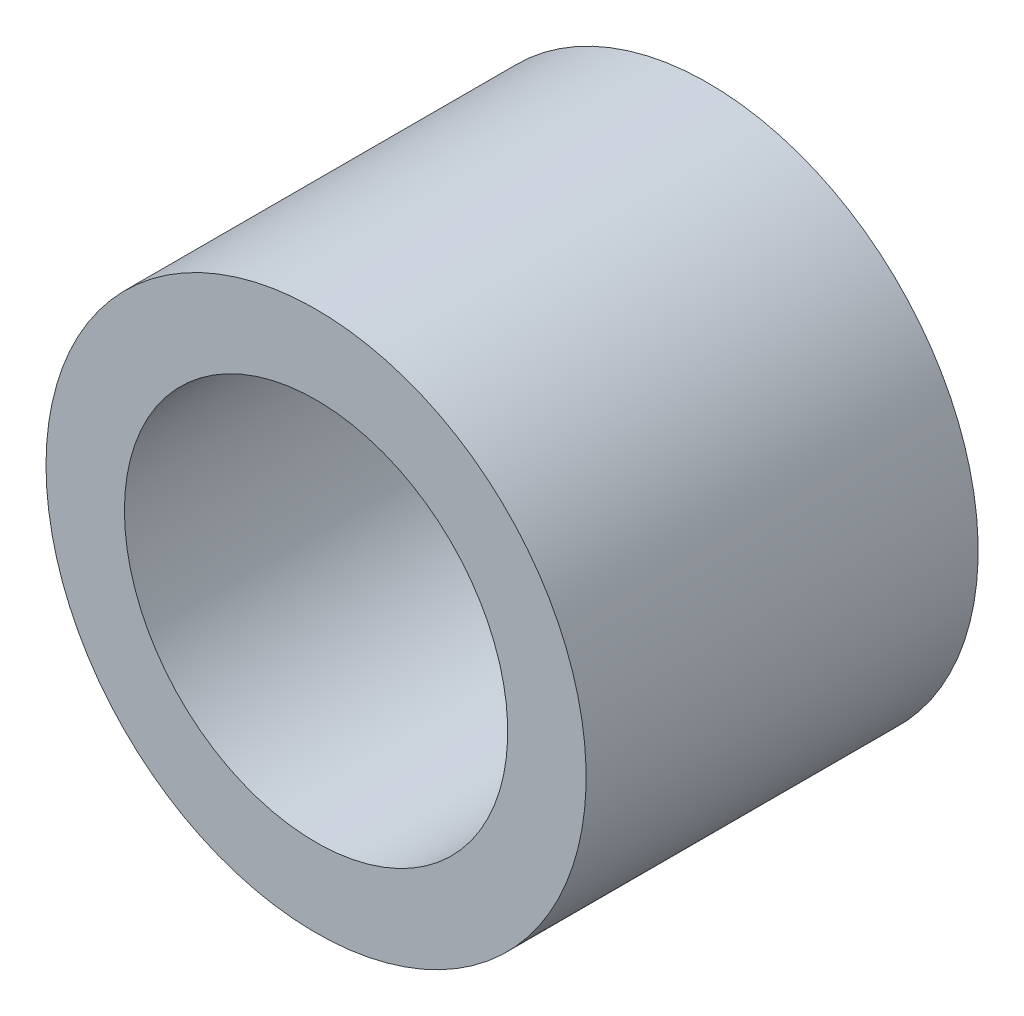
ISO-10303-21;
HEADER;
FILE_DESCRIPTION(('STEP AP214'),'2;1');
FILE_NAME('part.step','',(''),(''),'','','');
FILE_SCHEMA(('AUTOMOTIVE_DESIGN { 1 0 10303 214 1 1 1 1 }'));
ENDSEC;
DATA;
#1=APPLICATION_CONTEXT('core data for automotive mechanical design processes');
#2=APPLICATION_PROTOCOL_DEFINITION('international standard','automotive_design',2000,#1);
#3=PRODUCT_CONTEXT('',#1,'mechanical');
#4=PRODUCT('Part','Part','',(#3));
#5=PRODUCT_RELATED_PRODUCT_CATEGORY('part','',(#4));
#6=PRODUCT_DEFINITION_FORMATION('','',#4);
#7=PRODUCT_DEFINITION_CONTEXT('part definition',#1,'design');
#8=PRODUCT_DEFINITION('design','',#6,#7);
#9=PRODUCT_DEFINITION_SHAPE('','',#8);
#10=(LENGTH_UNIT() NAMED_UNIT(*) SI_UNIT(.MILLI.,.METRE.));
#11=(NAMED_UNIT(*) PLANE_ANGLE_UNIT() SI_UNIT($,.RADIAN.));
#12=(NAMED_UNIT(*) SI_UNIT($,.STERADIAN.) SOLID_ANGLE_UNIT());
#13=UNCERTAINTY_MEASURE_WITH_UNIT(LENGTH_MEASURE(1.E-05),#10,'distance_accuracy_value','');
#14=(GEOMETRIC_REPRESENTATION_CONTEXT(3) GLOBAL_UNCERTAINTY_ASSIGNED_CONTEXT((#13)) GLOBAL_UNIT_ASSIGNED_CONTEXT((#10,
#11,#12)) REPRESENTATION_CONTEXT('',''));
#15=CARTESIAN_POINT('',(0.,0.,0.));
#16=DIRECTION('',(0.,0.,1.));
#17=DIRECTION('',(1.,0.,0.));
#18=AXIS2_PLACEMENT_3D('',#15,#16,#17);
#19=CARTESIAN_POINT('',(0.,0.,22.5));
#20=DIRECTION('',(0.,0.,1.));
#21=DIRECTION('',(1.,0.,0.));
#22=AXIS2_PLACEMENT_3D('',#19,#20,#21);
#23=PLANE('',#22);
#24=CARTESIAN_POINT('',(0.,0.,22.5));
#25=DIRECTION('',(0.,0.,1.));
#26=DIRECTION('',(1.,0.,0.));
#27=AXIS2_PLACEMENT_3D('',#24,#25,#26);
#28=CIRCLE('',#27,15.5);
#29=CARTESIAN_POINT('',(-15.5,0.,22.5));
#30=VERTEX_POINT('',#29);
#31=EDGE_CURVE('E12',#30,#30,#28,.T.);
#32=ORIENTED_EDGE('',*,*,#31,.T.);
#33=EDGE_LOOP('',(#32));
#34=FACE_BOUND('',#33,.T.);
#35=CARTESIAN_POINT('',(0.,0.,22.5));
#36=DIRECTION('',(0.,0.,1.));
#37=DIRECTION('',(1.,0.,0.));
#38=AXIS2_PLACEMENT_3D('',#35,#36,#37);
#39=CIRCLE('',#38,11.);
#40=CARTESIAN_POINT('',(-11.,0.,22.5));
#41=VERTEX_POINT('',#40);
#42=EDGE_CURVE('E60',#41,#41,#39,.T.);
#43=ORIENTED_EDGE('',*,*,#42,.F.);
#44=EDGE_LOOP('',(#43));
#45=FACE_BOUND('',#44,.T.);
#46=ADVANCED_FACE('F47',(#34,#45),#23,.T.);
#47=CARTESIAN_POINT('',(0.,0.,0.));
#48=DIRECTION('',(0.,0.,1.));
#49=DIRECTION('',(1.,0.,0.));
#50=AXIS2_PLACEMENT_3D('',#47,#48,#49);
#51=PLANE('',#50);
#52=CARTESIAN_POINT('',(0.,0.,0.));
#53=DIRECTION('',(0.,0.,1.));
#54=DIRECTION('',(1.,0.,0.));
#55=AXIS2_PLACEMENT_3D('',#52,#53,#54);
#56=CIRCLE('',#55,15.5);
#57=CARTESIAN_POINT('',(-15.5,0.,0.));
#58=VERTEX_POINT('',#57);
#59=EDGE_CURVE('E51',#58,#58,#56,.T.);
#60=ORIENTED_EDGE('',*,*,#59,.F.);
#61=EDGE_LOOP('',(#60));
#62=FACE_BOUND('',#61,.T.);
#63=CARTESIAN_POINT('',(0.,0.,0.));
#64=DIRECTION('',(0.,0.,1.));
#65=DIRECTION('',(1.,0.,0.));
#66=AXIS2_PLACEMENT_3D('',#63,#64,#65);
#67=CIRCLE('',#66,11.);
#68=CARTESIAN_POINT('',(-11.,0.,0.));
#69=VERTEX_POINT('',#68);
#70=EDGE_CURVE('E62',#69,#69,#67,.T.);
#71=ORIENTED_EDGE('',*,*,#70,.T.);
#72=EDGE_LOOP('',(#71));
#73=FACE_BOUND('',#72,.T.);
#74=ADVANCED_FACE('F74',(#62,#73),#51,.F.);
#75=CARTESIAN_POINT('',(0.,0.,22.5));
#76=DIRECTION('',(0.,0.,-1.));
#77=DIRECTION('',(-1.,0.,0.));
#78=AXIS2_PLACEMENT_3D('',#75,#76,#77);
#79=CYLINDRICAL_SURFACE('',#78,15.5);
#80=CARTESIAN_POINT('',(-15.5,0.,22.5));
#81=CARTESIAN_POINT('',(-15.5,0.,22.265625));
#82=CARTESIAN_POINT('',(-15.5,0.,22.03125));
#83=CARTESIAN_POINT('',(-15.5,0.,21.5625));
#84=CARTESIAN_POINT('',(-15.5,0.,21.328125));
#85=CARTESIAN_POINT('',(-15.5,0.,20.859375));
#86=CARTESIAN_POINT('',(-15.5,0.,20.625));
#87=CARTESIAN_POINT('',(-15.5,0.,20.15625));
#88=CARTESIAN_POINT('',(-15.5,0.,19.921875));
#89=CARTESIAN_POINT('',(-15.5,0.,19.453125));
#90=CARTESIAN_POINT('',(-15.5,0.,19.21875));
#91=CARTESIAN_POINT('',(-15.5,0.,18.75));
#92=CARTESIAN_POINT('',(-15.5,0.,18.515625));
#93=CARTESIAN_POINT('',(-15.5,0.,18.046875));
#94=CARTESIAN_POINT('',(-15.5,0.,17.8125));
#95=CARTESIAN_POINT('',(-15.5,0.,17.34375));
#96=CARTESIAN_POINT('',(-15.5,0.,17.109375));
#97=CARTESIAN_POINT('',(-15.5,0.,16.640625));
#98=CARTESIAN_POINT('',(-15.5,0.,16.40625));
#99=CARTESIAN_POINT('',(-15.5,0.,15.9375));
#100=CARTESIAN_POINT('',(-15.5,0.,15.703125));
#101=CARTESIAN_POINT('',(-15.5,0.,15.234375));
#102=CARTESIAN_POINT('',(-15.5,0.,15.));
#103=CARTESIAN_POINT('',(-15.5,0.,14.53125));
#104=CARTESIAN_POINT('',(-15.5,0.,14.296875));
#105=CARTESIAN_POINT('',(-15.5,0.,13.828125));
#106=CARTESIAN_POINT('',(-15.5,0.,13.59375));
#107=CARTESIAN_POINT('',(-15.5,0.,13.125));
#108=CARTESIAN_POINT('',(-15.5,0.,12.890625));
#109=CARTESIAN_POINT('',(-15.5,0.,12.421875));
#110=CARTESIAN_POINT('',(-15.5,0.,12.1875));
#111=CARTESIAN_POINT('',(-15.5,0.,11.71875));
#112=CARTESIAN_POINT('',(-15.5,0.,11.484375));
#113=CARTESIAN_POINT('',(-15.5,0.,11.015625));
#114=CARTESIAN_POINT('',(-15.5,0.,10.78125));
#115=CARTESIAN_POINT('',(-15.5,0.,10.3125));
#116=CARTESIAN_POINT('',(-15.5,0.,10.078125));
#117=CARTESIAN_POINT('',(-15.5,0.,9.609375));
#118=CARTESIAN_POINT('',(-15.5,0.,9.375));
#119=CARTESIAN_POINT('',(-15.5,0.,8.90625));
#120=CARTESIAN_POINT('',(-15.5,0.,8.671875));
#121=CARTESIAN_POINT('',(-15.5,0.,8.203125));
#122=CARTESIAN_POINT('',(-15.5,0.,7.96875));
#123=CARTESIAN_POINT('',(-15.5,0.,7.5));
#124=CARTESIAN_POINT('',(-15.5,0.,7.265625));
#125=CARTESIAN_POINT('',(-15.5,0.,6.796875));
#126=CARTESIAN_POINT('',(-15.5,0.,6.5625));
#127=CARTESIAN_POINT('',(-15.5,0.,6.09375));
#128=CARTESIAN_POINT('',(-15.5,0.,5.859375));
#129=CARTESIAN_POINT('',(-15.5,0.,5.390625));
#130=CARTESIAN_POINT('',(-15.5,0.,5.15625));
#131=CARTESIAN_POINT('',(-15.5,0.,4.6875));
#132=CARTESIAN_POINT('',(-15.5,0.,4.453125));
#133=CARTESIAN_POINT('',(-15.5,0.,3.984375));
#134=CARTESIAN_POINT('',(-15.5,0.,3.75));
#135=CARTESIAN_POINT('',(-15.5,0.,3.28125));
#136=CARTESIAN_POINT('',(-15.5,0.,3.046875));
#137=CARTESIAN_POINT('',(-15.5,0.,2.578125));
#138=CARTESIAN_POINT('',(-15.5,0.,2.34375));
#139=CARTESIAN_POINT('',(-15.5,0.,1.875));
#140=CARTESIAN_POINT('',(-15.5,0.,1.640625));
#141=CARTESIAN_POINT('',(-15.5,0.,1.171875));
#142=CARTESIAN_POINT('',(-15.5,0.,0.937499999999996));
#143=CARTESIAN_POINT('',(-15.5,0.,0.468749999999996));
#144=CARTESIAN_POINT('',(-15.5,0.,0.234374999999996));
#145=CARTESIAN_POINT('',(-15.5,0.,0.));
#146=B_SPLINE_CURVE_WITH_KNOTS('',3,(#80,#81,#82,#83,#84,#85,#86,#87,#88,#89,#90,#91,#92,#93,
#94,#95,#96,#97,#98,#99,#100,#101,#102,#103,#104,#105,#106,#107,#108,#109,#110,#111,#112,#113,
#114,#115,#116,#117,#118,#119,#120,#121,#122,#123,#124,#125,#126,#127,#128,#129,#130,#131,#132,
#133,#134,#135,#136,#137,#138,#139,#140,#141,#142,#143,#144,#145),.UNSPECIFIED.,.F.,.F.,(4,2,2,
2,2,2,2,2,2,2,2,2,2,2,2,2,2,2,2,2,2,2,2,2,2,2,2,2,2,2,2,2,4),(0.,0.703124999999999,1.40625,
2.109375,2.8125,3.515625,4.21875,4.921875,5.625,6.328125,7.03125,7.734375,8.4375,9.140625,
9.84375,10.546875,11.25,11.953125,12.65625,13.359375,14.0625,14.765625,15.46875,16.171875,
16.875,17.578125,18.28125,18.984375,19.6875,20.390625,21.09375,21.796875,22.5),.UNSPECIFIED.);
#147=EDGE_CURVE('BSEAM49',#30,#58,#146,.T.);
#148=ORIENTED_EDGE('',*,*,#31,.F.);
#149=ORIENTED_EDGE('',*,*,#59,.T.);
#150=ORIENTED_EDGE('',*,*,#147,.T.);
#151=ORIENTED_EDGE('',*,*,#147,.F.);
#152=EDGE_LOOP('',(#148,#150,#149,#151));
#153=FACE_BOUND('',#152,.T.);
#154=ADVANCED_FACE('F49',(#153),#79,.T.);
#155=CARTESIAN_POINT('',(0.,0.,22.5));
#156=DIRECTION('',(0.,0.,-1.));
#157=DIRECTION('',(-1.,0.,0.));
#158=AXIS2_PLACEMENT_3D('',#155,#156,#157);
#159=CYLINDRICAL_SURFACE('',#158,11.);
#160=CARTESIAN_POINT('',(-11.,0.,22.5));
#161=CARTESIAN_POINT('',(-11.,0.,22.265625));
#162=CARTESIAN_POINT('',(-11.,0.,22.03125));
#163=CARTESIAN_POINT('',(-11.,0.,21.5625));
#164=CARTESIAN_POINT('',(-11.,0.,21.328125));
#165=CARTESIAN_POINT('',(-11.,0.,20.859375));
#166=CARTESIAN_POINT('',(-11.,0.,20.625));
#167=CARTESIAN_POINT('',(-11.,0.,20.15625));
#168=CARTESIAN_POINT('',(-11.,0.,19.921875));
#169=CARTESIAN_POINT('',(-11.,0.,19.453125));
#170=CARTESIAN_POINT('',(-11.,0.,19.21875));
#171=CARTESIAN_POINT('',(-11.,0.,18.75));
#172=CARTESIAN_POINT('',(-11.,0.,18.515625));
#173=CARTESIAN_POINT('',(-11.,0.,18.046875));
#174=CARTESIAN_POINT('',(-11.,0.,17.8125));
#175=CARTESIAN_POINT('',(-11.,0.,17.34375));
#176=CARTESIAN_POINT('',(-11.,0.,17.109375));
#177=CARTESIAN_POINT('',(-11.,0.,16.640625));
#178=CARTESIAN_POINT('',(-11.,0.,16.40625));
#179=CARTESIAN_POINT('',(-11.,0.,15.9375));
#180=CARTESIAN_POINT('',(-11.,0.,15.703125));
#181=CARTESIAN_POINT('',(-11.,0.,15.234375));
#182=CARTESIAN_POINT('',(-11.,0.,15.));
#183=CARTESIAN_POINT('',(-11.,0.,14.53125));
#184=CARTESIAN_POINT('',(-11.,0.,14.296875));
#185=CARTESIAN_POINT('',(-11.,0.,13.828125));
#186=CARTESIAN_POINT('',(-11.,0.,13.59375));
#187=CARTESIAN_POINT('',(-11.,0.,13.125));
#188=CARTESIAN_POINT('',(-11.,0.,12.890625));
#189=CARTESIAN_POINT('',(-11.,0.,12.421875));
#190=CARTESIAN_POINT('',(-11.,0.,12.1875));
#191=CARTESIAN_POINT('',(-11.,0.,11.71875));
#192=CARTESIAN_POINT('',(-11.,0.,11.484375));
#193=CARTESIAN_POINT('',(-11.,0.,11.015625));
#194=CARTESIAN_POINT('',(-11.,0.,10.78125));
#195=CARTESIAN_POINT('',(-11.,0.,10.3125));
#196=CARTESIAN_POINT('',(-11.,0.,10.078125));
#197=CARTESIAN_POINT('',(-11.,0.,9.60937499999999));
#198=CARTESIAN_POINT('',(-11.,0.,9.375));
#199=CARTESIAN_POINT('',(-11.,0.,8.90625));
#200=CARTESIAN_POINT('',(-11.,0.,8.671875));
#201=CARTESIAN_POINT('',(-11.,0.,8.20312499999999));
#202=CARTESIAN_POINT('',(-11.,0.,7.96874999999999));
#203=CARTESIAN_POINT('',(-11.,0.,7.5));
#204=CARTESIAN_POINT('',(-11.,0.,7.265625));
#205=CARTESIAN_POINT('',(-11.,0.,6.796875));
#206=CARTESIAN_POINT('',(-11.,0.,6.5625));
#207=CARTESIAN_POINT('',(-11.,0.,6.09375));
#208=CARTESIAN_POINT('',(-11.,0.,5.859375));
#209=CARTESIAN_POINT('',(-11.,0.,5.390625));
#210=CARTESIAN_POINT('',(-11.,0.,5.15625));
#211=CARTESIAN_POINT('',(-11.,0.,4.6875));
#212=CARTESIAN_POINT('',(-11.,0.,4.453125));
#213=CARTESIAN_POINT('',(-11.,0.,3.984375));
#214=CARTESIAN_POINT('',(-11.,0.,3.75));
#215=CARTESIAN_POINT('',(-11.,0.,3.28125));
#216=CARTESIAN_POINT('',(-11.,0.,3.046875));
#217=CARTESIAN_POINT('',(-11.,0.,2.578125));
#218=CARTESIAN_POINT('',(-11.,0.,2.34375));
#219=CARTESIAN_POINT('',(-11.,0.,1.875));
#220=CARTESIAN_POINT('',(-11.,0.,1.640625));
#221=CARTESIAN_POINT('',(-11.,0.,1.171875));
#222=CARTESIAN_POINT('',(-11.,0.,0.937499999999996));
#223=CARTESIAN_POINT('',(-11.,0.,0.468749999999996));
#224=CARTESIAN_POINT('',(-11.,0.,0.234374999999996));
#225=CARTESIAN_POINT('',(-11.,0.,0.));
#226=B_SPLINE_CURVE_WITH_KNOTS('',3,(#160,#161,#162,#163,#164,#165,#166,#167,#168,#169,#170,
#171,#172,#173,#174,#175,#176,#177,#178,#179,#180,#181,#182,#183,#184,#185,#186,#187,#188,#189,
#190,#191,#192,#193,#194,#195,#196,#197,#198,#199,#200,#201,#202,#203,#204,#205,#206,#207,#208,
#209,#210,#211,#212,#213,#214,#215,#216,#217,#218,#219,#220,#221,#222,#223,#224,#225),
.UNSPECIFIED.,.F.,.F.,(4,2,2,2,2,2,2,2,2,2,2,2,2,2,2,2,2,2,2,2,2,2,2,2,2,2,2,2,2,2,2,2,4),(0.,
0.703125000000002,1.40625,2.109375,2.8125,3.515625,4.21875,4.921875,5.625,6.328125,7.03125,
7.734375,8.4375,9.140625,9.84375,10.546875,11.25,11.953125,12.65625,13.359375,14.0625,14.765625,
15.46875,16.171875,16.875,17.578125,18.28125,18.984375,19.6875,20.390625,21.09375,21.796875,
22.5),.UNSPECIFIED.);
#227=EDGE_CURVE('BSEAM70',#41,#69,#226,.T.);
#228=ORIENTED_EDGE('',*,*,#42,.T.);
#229=ORIENTED_EDGE('',*,*,#70,.F.);
#230=ORIENTED_EDGE('',*,*,#227,.T.);
#231=ORIENTED_EDGE('',*,*,#227,.F.);
#232=EDGE_LOOP('',(#228,#230,#229,#231));
#233=FACE_BOUND('',#232,.T.);
#234=ADVANCED_FACE('F70',(#233),#159,.F.);
#235=CLOSED_SHELL('',(#46,#74,#154,#234));
#236=MANIFOLD_SOLID_BREP('B2',#235);
#237=ADVANCED_BREP_SHAPE_REPRESENTATION('',(#18,#236),#14);
#238=SHAPE_DEFINITION_REPRESENTATION(#9,#237);
ENDSEC;
END-ISO-10303-21;
